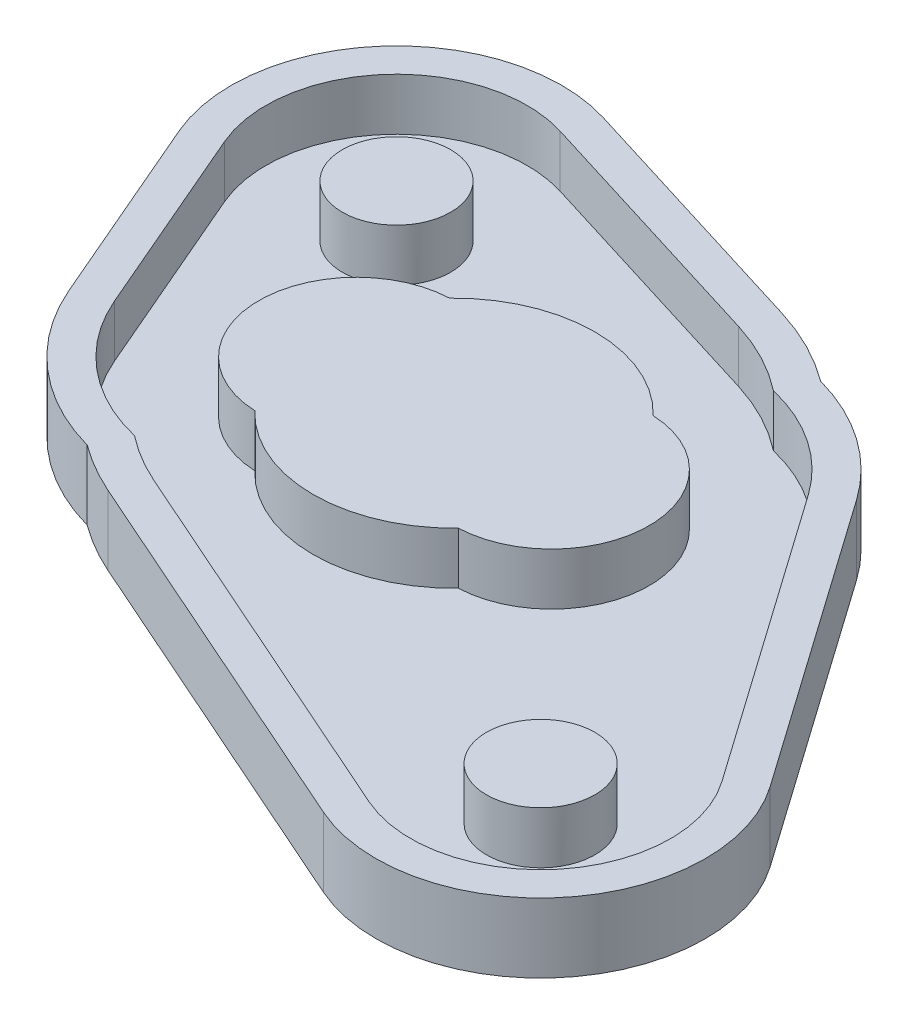
ISO-10303-21;
HEADER;
FILE_DESCRIPTION(('STEP AP214'),'2;1');
FILE_NAME('part.step','',(''),(''),'','','');
FILE_SCHEMA(('AUTOMOTIVE_DESIGN { 1 0 10303 214 1 1 1 1 }'));
ENDSEC;
DATA;
#1=APPLICATION_CONTEXT('core data for automotive mechanical design processes');
#2=APPLICATION_PROTOCOL_DEFINITION('international standard','automotive_design',2000,#1);
#3=PRODUCT_CONTEXT('',#1,'mechanical');
#4=PRODUCT('Part','Part','',(#3));
#5=PRODUCT_RELATED_PRODUCT_CATEGORY('part','',(#4));
#6=PRODUCT_DEFINITION_FORMATION('','',#4);
#7=PRODUCT_DEFINITION_CONTEXT('part definition',#1,'design');
#8=PRODUCT_DEFINITION('design','',#6,#7);
#9=PRODUCT_DEFINITION_SHAPE('','',#8);
#10=(LENGTH_UNIT() NAMED_UNIT(*) SI_UNIT(.MILLI.,.METRE.));
#11=(NAMED_UNIT(*) PLANE_ANGLE_UNIT() SI_UNIT($,.RADIAN.));
#12=(NAMED_UNIT(*) SI_UNIT($,.STERADIAN.) SOLID_ANGLE_UNIT());
#13=UNCERTAINTY_MEASURE_WITH_UNIT(LENGTH_MEASURE(1.E-05),#10,'distance_accuracy_value','');
#14=(GEOMETRIC_REPRESENTATION_CONTEXT(3) GLOBAL_UNCERTAINTY_ASSIGNED_CONTEXT((#13)) GLOBAL_UNIT_ASSIGNED_CONTEXT((#10,
#11,#12)) REPRESENTATION_CONTEXT('',''));
#15=CARTESIAN_POINT('',(0.,0.,0.));
#16=DIRECTION('',(0.,0.,1.));
#17=DIRECTION('',(1.,0.,0.));
#18=AXIS2_PLACEMENT_3D('',#15,#16,#17);
#19=CARTESIAN_POINT('',(-5.62499999999999,3.,0.));
#20=DIRECTION('',(0.,-1.,0.));
#21=DIRECTION('',(0.,0.,-1.));
#22=AXIS2_PLACEMENT_3D('',#19,#20,#21);
#23=CYLINDRICAL_SURFACE('',#22,12.625);
#24=DIRECTION('',(0.,-1.,0.));
#25=VECTOR('',#24,1.);
#26=CARTESIAN_POINT('',(-17.2229499881261,3.,4.98780323117542));
#27=LINE('',#26,#25);
#28=CARTESIAN_POINT('',(-17.2229499881261,3.,4.98780323117542));
#29=VERTEX_POINT('',#28);
#30=CARTESIAN_POINT('',(-17.2229499881261,-1.,4.98780323117542));
#31=VERTEX_POINT('',#30);
#32=EDGE_CURVE('E582',#29,#31,#27,.T.);
#33=ORIENTED_EDGE('',*,*,#32,.T.);
#34=CARTESIAN_POINT('',(-5.62499999999999,-1.,0.));
#35=DIRECTION('',(0.,-1.,0.));
#36=DIRECTION('',(0.,0.,-1.));
#37=AXIS2_PLACEMENT_3D('',#34,#35,#36);
#38=CIRCLE('',#37,12.625);
#39=CARTESIAN_POINT('',(-8.97916666666668,-1.,12.1712855102582));
#40=VERTEX_POINT('',#39);
#41=EDGE_CURVE('E438',#40,#31,#38,.T.);
#42=ORIENTED_EDGE('',*,*,#41,.F.);
#43=DIRECTION('',(0.,-1.,0.));
#44=VECTOR('',#43,1.);
#45=CARTESIAN_POINT('',(-8.97916666666669,3.,12.1712855102582));
#46=LINE('',#45,#44);
#47=CARTESIAN_POINT('',(-8.97916666666669,3.,12.1712855102582));
#48=VERTEX_POINT('',#47);
#49=EDGE_CURVE('E610',#48,#40,#46,.T.);
#50=ORIENTED_EDGE('',*,*,#49,.F.);
#51=CARTESIAN_POINT('',(-5.62499999999999,3.,0.));
#52=DIRECTION('',(0.,1.,0.));
#53=DIRECTION('',(0.,0.,1.));
#54=AXIS2_PLACEMENT_3D('',#51,#52,#53);
#55=CIRCLE('',#54,12.625);
#56=EDGE_CURVE('E513',#48,#29,#55,.F.);
#57=ORIENTED_EDGE('',*,*,#56,.T.);
#58=EDGE_LOOP('',(#33,#42,#50,#57));
#59=FACE_BOUND('',#58,.T.);
#60=ADVANCED_FACE('F230',(#59),#23,.T.);
#61=CARTESIAN_POINT('',(0.,3.,0.));
#62=DIRECTION('',(0.,-1.,0.));
#63=DIRECTION('',(0.,0.,-1.));
#64=AXIS2_PLACEMENT_3D('',#61,#62,#63);
#65=CYLINDRICAL_SURFACE('',#64,15.125);
#66=ORIENTED_EDGE('',*,*,#49,.T.);
#67=CARTESIAN_POINT('',(0.,-1.,0.));
#68=DIRECTION('',(0.,-1.,0.));
#69=DIRECTION('',(0.,0.,-1.));
#70=AXIS2_PLACEMENT_3D('',#67,#68,#69);
#71=CIRCLE('',#70,15.125);
#72=CARTESIAN_POINT('',(-6.11980577871939,-1.,13.8316160382926));
#73=VERTEX_POINT('',#72);
#74=EDGE_CURVE('E419',#73,#40,#71,.T.);
#75=ORIENTED_EDGE('',*,*,#74,.F.);
#76=DIRECTION('',(0.,-1.,0.));
#77=VECTOR('',#76,1.);
#78=CARTESIAN_POINT('',(-6.11980577871939,3.,13.8316160382926));
#79=LINE('',#78,#77);
#80=CARTESIAN_POINT('',(-6.11980577871939,3.,13.8316160382926));
#81=VERTEX_POINT('',#80);
#82=EDGE_CURVE('E607',#81,#73,#79,.T.);
#83=ORIENTED_EDGE('',*,*,#82,.F.);
#84=CARTESIAN_POINT('',(0.,3.,0.));
#85=DIRECTION('',(0.,1.,0.));
#86=DIRECTION('',(0.,0.,1.));
#87=AXIS2_PLACEMENT_3D('',#84,#85,#86);
#88=CIRCLE('',#87,15.125);
#89=EDGE_CURVE('E517',#48,#81,#88,.T.);
#90=ORIENTED_EDGE('',*,*,#89,.F.);
#91=EDGE_LOOP('',(#66,#75,#83,#90));
#92=FACE_BOUND('',#91,.T.);
#93=ADVANCED_FACE('F713',(#92),#65,.T.);
#94=CARTESIAN_POINT('',(-6.1198057787194,3.,13.8316160382926));
#95=DIRECTION('',(0.40461525809715,0.,-0.914487010796204));
#96=DIRECTION('',(-0.914487010796204,0.,-0.404615258097151));
#97=AXIS2_PLACEMENT_3D('',#94,#95,#96);
#98=PLANE('',#97);
#99=ORIENTED_EDGE('',*,*,#82,.T.);
#100=DIRECTION('',(-0.914487010796204,0.,-0.40461525809715));
#101=VECTOR('',#100,1.);
#102=CARTESIAN_POINT('',(16.1561550480772,-1.,23.6876266025639));
#103=LINE('',#102,#101);
#104=CARTESIAN_POINT('',(16.1561550480772,-1.,23.6876266025639));
#105=VERTEX_POINT('',#104);
#106=EDGE_CURVE('E470',#105,#73,#103,.T.);
#107=ORIENTED_EDGE('',*,*,#106,.F.);
#108=DIRECTION('',(0.,-1.,0.));
#109=VECTOR('',#108,1.);
#110=CARTESIAN_POINT('',(16.1561550480772,3.,23.6876266025639));
#111=LINE('',#110,#109);
#112=CARTESIAN_POINT('',(16.1561550480772,3.,23.6876266025639));
#113=VERTEX_POINT('',#112);
#114=EDGE_CURVE('E604',#113,#105,#111,.T.);
#115=ORIENTED_EDGE('',*,*,#114,.F.);
#116=DIRECTION('',(0.914487010796204,0.,0.404615258097151));
#117=VECTOR('',#116,1.);
#118=CARTESIAN_POINT('',(-6.1198057787194,3.,13.8316160382926));
#119=LINE('',#118,#117);
#120=EDGE_CURVE('E521',#81,#113,#119,.T.);
#121=ORIENTED_EDGE('',*,*,#120,.F.);
#122=EDGE_LOOP('',(#99,#107,#115,#121));
#123=FACE_BOUND('',#122,.T.);
#124=ADVANCED_FACE('F716',(#123),#98,.F.);
#125=CARTESIAN_POINT('',(20.0000000000001,3.,15.));
#126=DIRECTION('',(0.,-1.,0.));
#127=DIRECTION('',(0.,0.,-1.));
#128=AXIS2_PLACEMENT_3D('',#125,#126,#127);
#129=CYLINDRICAL_SURFACE('',#128,9.50000000000001);
#130=ORIENTED_EDGE('',*,*,#114,.T.);
#131=CARTESIAN_POINT('',(20.0000000000001,-1.,15.));
#132=DIRECTION('',(0.,-1.,0.));
#133=DIRECTION('',(0.,0.,-1.));
#134=AXIS2_PLACEMENT_3D('',#131,#132,#133);
#135=CIRCLE('',#134,9.50000000000001);
#136=CARTESIAN_POINT('',(27.7695426123718,-1.,9.53335499647711));
#137=VERTEX_POINT('',#136);
#138=EDGE_CURVE('E466',#137,#105,#135,.T.);
#139=ORIENTED_EDGE('',*,*,#138,.F.);
#140=DIRECTION('',(0.,-1.,0.));
#141=VECTOR('',#140,1.);
#142=CARTESIAN_POINT('',(27.7695426123718,3.,9.53335499647711));
#143=LINE('',#142,#141);
#144=CARTESIAN_POINT('',(27.7695426123718,3.,9.53335499647711));
#145=VERTEX_POINT('',#144);
#146=EDGE_CURVE('E601',#145,#137,#143,.T.);
#147=ORIENTED_EDGE('',*,*,#146,.F.);
#148=CARTESIAN_POINT('',(20.0000000000001,3.,15.));
#149=DIRECTION('',(0.,1.,0.));
#150=DIRECTION('',(0.,0.,1.));
#151=AXIS2_PLACEMENT_3D('',#148,#149,#150);
#152=CIRCLE('',#151,9.50000000000001);
#153=EDGE_CURVE('E525',#113,#145,#152,.T.);
#154=ORIENTED_EDGE('',*,*,#153,.F.);
#155=EDGE_LOOP('',(#130,#139,#147,#154));
#156=FACE_BOUND('',#155,.T.);
#157=ADVANCED_FACE('F723',(#156),#129,.T.);
#158=CARTESIAN_POINT('',(14.0877240925432,3.,-9.91211328178847));
#159=DIRECTION('',(0.817846590775959,0.,-0.575436316160303));
#160=DIRECTION('',(-0.575436316160303,0.,-0.81784659077596));
#161=AXIS2_PLACEMENT_3D('',#158,#159,#160);
#162=PLANE('',#161);
#163=ORIENTED_EDGE('',*,*,#146,.T.);
#164=DIRECTION('',(0.575436316160303,0.,0.817846590775959));
#165=VECTOR('',#164,1.);
#166=CARTESIAN_POINT('',(15.9503132085465,-1.,-7.26488349152382));
#167=LINE('',#166,#165);
#168=CARTESIAN_POINT('',(15.9503132085465,-1.,-7.26488349152382));
#169=VERTEX_POINT('',#168);
#170=EDGE_CURVE('E462',#169,#137,#167,.T.);
#171=ORIENTED_EDGE('',*,*,#170,.F.);
#172=DIRECTION('',(0.,-1.,0.));
#173=VECTOR('',#172,1.);
#174=CARTESIAN_POINT('',(15.9503132085465,3.,-7.26488349152382));
#175=LINE('',#174,#173);
#176=CARTESIAN_POINT('',(15.9503132085465,3.,-7.26488349152382));
#177=VERTEX_POINT('',#176);
#178=EDGE_CURVE('E598',#177,#169,#175,.T.);
#179=ORIENTED_EDGE('',*,*,#178,.F.);
#180=DIRECTION('',(0.575436316160303,0.,0.81784659077596));
#181=VECTOR('',#180,1.);
#182=CARTESIAN_POINT('',(14.0877240925432,3.,-9.91211328178847));
#183=LINE('',#182,#181);
#184=EDGE_CURVE('E528',#177,#145,#183,.T.);
#185=ORIENTED_EDGE('',*,*,#184,.T.);
#186=EDGE_LOOP('',(#163,#171,#179,#185));
#187=FACE_BOUND('',#186,.T.);
#188=ADVANCED_FACE('F728',(#187),#162,.T.);
#189=CARTESIAN_POINT('',(5.62499999999999,3.,0.));
#190=DIRECTION('',(0.,-1.,0.));
#191=DIRECTION('',(0.,0.,-1.));
#192=AXIS2_PLACEMENT_3D('',#189,#190,#191);
#193=CYLINDRICAL_SURFACE('',#192,12.625);
#194=ORIENTED_EDGE('',*,*,#178,.T.);
#195=CARTESIAN_POINT('',(5.62499999999999,-1.,0.));
#196=DIRECTION('',(0.,-1.,0.));
#197=DIRECTION('',(0.,0.,-1.));
#198=AXIS2_PLACEMENT_3D('',#195,#196,#197);
#199=CIRCLE('',#198,12.625);
#200=CARTESIAN_POINT('',(8.97916666666665,-1.,-12.1712855102582));
#201=VERTEX_POINT('',#200);
#202=EDGE_CURVE('E458',#201,#169,#199,.T.);
#203=ORIENTED_EDGE('',*,*,#202,.F.);
#204=DIRECTION('',(0.,-1.,0.));
#205=VECTOR('',#204,1.);
#206=CARTESIAN_POINT('',(8.97916666666665,3.,-12.1712855102582));
#207=LINE('',#206,#205);
#208=CARTESIAN_POINT('',(8.97916666666665,3.,-12.1712855102582));
#209=VERTEX_POINT('',#208);
#210=EDGE_CURVE('E595',#209,#201,#207,.T.);
#211=ORIENTED_EDGE('',*,*,#210,.F.);
#212=CARTESIAN_POINT('',(5.62499999999999,3.,0.));
#213=DIRECTION('',(0.,1.,0.));
#214=DIRECTION('',(0.,0.,1.));
#215=AXIS2_PLACEMENT_3D('',#212,#213,#214);
#216=CIRCLE('',#215,12.625);
#217=EDGE_CURVE('E532',#177,#209,#216,.T.);
#218=ORIENTED_EDGE('',*,*,#217,.F.);
#219=EDGE_LOOP('',(#194,#203,#211,#218));
#220=FACE_BOUND('',#219,.T.);
#221=ADVANCED_FACE('F731',(#220),#193,.T.);
#222=CARTESIAN_POINT('',(0.,3.,0.));
#223=DIRECTION('',(0.,-1.,0.));
#224=DIRECTION('',(0.,0.,-1.));
#225=AXIS2_PLACEMENT_3D('',#222,#223,#224);
#226=CYLINDRICAL_SURFACE('',#225,15.125);
#227=ORIENTED_EDGE('',*,*,#210,.T.);
#228=CARTESIAN_POINT('',(0.,-1.,0.));
#229=DIRECTION('',(0.,-1.,0.));
#230=DIRECTION('',(0.,0.,-1.));
#231=AXIS2_PLACEMENT_3D('',#228,#229,#230);
#232=CIRCLE('',#231,15.125);
#233=CARTESIAN_POINT('',(4.46813397174806,-1.,-14.4499620695181));
#234=VERTEX_POINT('',#233);
#235=EDGE_CURVE('E454',#234,#201,#232,.T.);
#236=ORIENTED_EDGE('',*,*,#235,.F.);
#237=DIRECTION('',(0.,-1.,0.));
#238=VECTOR('',#237,1.);
#239=CARTESIAN_POINT('',(4.46813397174806,3.,-14.4499620695181));
#240=LINE('',#239,#238);
#241=CARTESIAN_POINT('',(4.46813397174806,3.,-14.4499620695181));
#242=VERTEX_POINT('',#241);
#243=EDGE_CURVE('E592',#242,#234,#240,.T.);
#244=ORIENTED_EDGE('',*,*,#243,.F.);
#245=CARTESIAN_POINT('',(0.,3.,0.));
#246=DIRECTION('',(0.,1.,0.));
#247=DIRECTION('',(0.,0.,1.));
#248=AXIS2_PLACEMENT_3D('',#245,#246,#247);
#249=CIRCLE('',#248,15.125);
#250=EDGE_CURVE('E536',#209,#242,#249,.T.);
#251=ORIENTED_EDGE('',*,*,#250,.F.);
#252=EDGE_LOOP('',(#227,#236,#244,#251));
#253=FACE_BOUND('',#252,.T.);
#254=ADVANCED_FACE('F734',(#253),#226,.T.);
#255=CARTESIAN_POINT('',(4.46813397174806,3.,-14.449962069518));
#256=DIRECTION('',(0.295413816313922,0.,-0.955369393025988));
#257=DIRECTION('',(-0.955369393025988,0.,-0.295413816313922));
#258=AXIS2_PLACEMENT_3D('',#255,#256,#257);
#259=PLANE('',#258);
#260=ORIENTED_EDGE('',*,*,#243,.T.);
#261=DIRECTION('',(0.955369393025988,0.,0.295413816313922));
#262=VECTOR('',#261,1.);
#263=CARTESIAN_POINT('',(-10.4362971430528,-1.,-19.0586243395805));
#264=LINE('',#263,#262);
#265=CARTESIAN_POINT('',(-10.4362971430528,-1.,-19.0586243395805));
#266=VERTEX_POINT('',#265);
#267=EDGE_CURVE('E450',#266,#234,#264,.T.);
#268=ORIENTED_EDGE('',*,*,#267,.F.);
#269=DIRECTION('',(0.,-1.,0.));
#270=VECTOR('',#269,1.);
#271=CARTESIAN_POINT('',(-10.4362971430528,3.,-19.0586243395805));
#272=LINE('',#271,#270);
#273=CARTESIAN_POINT('',(-10.4362971430528,3.,-19.0586243395805));
#274=VERTEX_POINT('',#273);
#275=EDGE_CURVE('E589',#274,#266,#272,.T.);
#276=ORIENTED_EDGE('',*,*,#275,.F.);
#277=DIRECTION('',(0.955369393025988,0.,0.295413816313922));
#278=VECTOR('',#277,1.);
#279=CARTESIAN_POINT('',(4.46813397174806,3.,-14.449962069518));
#280=LINE('',#279,#278);
#281=EDGE_CURVE('E539',#274,#242,#280,.T.);
#282=ORIENTED_EDGE('',*,*,#281,.T.);
#283=EDGE_LOOP('',(#260,#268,#276,#282));
#284=FACE_BOUND('',#283,.T.);
#285=ADVANCED_FACE('F739',(#284),#259,.T.);
#286=CARTESIAN_POINT('',(-13.2554213597741,3.,-9.94156601983052));
#287=DIRECTION('',(0.,-1.,0.));
#288=DIRECTION('',(0.,0.,-1.));
#289=AXIS2_PLACEMENT_3D('',#286,#287,#288);
#290=CYLINDRICAL_SURFACE('',#289,9.54296671664666);
#291=ORIENTED_EDGE('',*,*,#275,.T.);
#292=CARTESIAN_POINT('',(-13.2554213597741,-1.,-9.94156601983052));
#293=DIRECTION('',(0.,-1.,0.));
#294=DIRECTION('',(0.,0.,-1.));
#295=AXIS2_PLACEMENT_3D('',#292,#293,#294);
#296=CIRCLE('',#295,9.54296671664666);
#297=CARTESIAN_POINT('',(-22.0220630008055,-1.,-6.17139253671847));
#298=VERTEX_POINT('',#297);
#299=EDGE_CURVE('E446',#298,#266,#296,.T.);
#300=ORIENTED_EDGE('',*,*,#299,.F.);
#301=DIRECTION('',(0.,-1.,0.));
#302=VECTOR('',#301,1.);
#303=CARTESIAN_POINT('',(-22.0220630008055,3.,-6.17139253671847));
#304=LINE('',#303,#302);
#305=CARTESIAN_POINT('',(-22.0220630008055,3.,-6.17139253671847));
#306=VERTEX_POINT('',#305);
#307=EDGE_CURVE('E585',#306,#298,#304,.T.);
#308=ORIENTED_EDGE('',*,*,#307,.F.);
#309=CARTESIAN_POINT('',(-13.2554213597741,3.,-9.94156601983052));
#310=DIRECTION('',(0.,1.,0.));
#311=DIRECTION('',(0.,0.,1.));
#312=AXIS2_PLACEMENT_3D('',#309,#310,#311);
#313=CIRCLE('',#312,9.54296671664666);
#314=EDGE_CURVE('E543',#274,#306,#313,.T.);
#315=ORIENTED_EDGE('',*,*,#314,.F.);
#316=EDGE_LOOP('',(#291,#300,#308,#315));
#317=FACE_BOUND('',#316,.T.);
#318=ADVANCED_FACE('F744',(#317),#290,.T.);
#319=CARTESIAN_POINT('',(-13.2554213597741,3.,-9.94156601983052));
#320=DIRECTION('',(0.,-1.,0.));
#321=DIRECTION('',(0.,0.,-1.));
#322=AXIS2_PLACEMENT_3D('',#319,#320,#321);
#323=CYLINDRICAL_SURFACE('',#322,7.54296671664666);
#324=CARTESIAN_POINT('',(-13.2554213597741,0.,-9.94156601983052));
#325=DIRECTION('',(0.,1.,0.));
#326=DIRECTION('',(0.,0.,1.));
#327=AXIS2_PLACEMENT_3D('',#324,#325,#326);
#328=CIRCLE('',#327,7.54296671664666);
#329=CARTESIAN_POINT('',(-11.0271247756806,0.,-17.1478855535285));
#330=VERTEX_POINT('',#329);
#331=CARTESIAN_POINT('',(-20.1847639927855,0.,-6.96153958324131));
#332=VERTEX_POINT('',#331);
#333=EDGE_CURVE('E474',#330,#332,#328,.T.);
#334=ORIENTED_EDGE('',*,*,#333,.F.);
#335=DIRECTION('',(0.,-1.,0.));
#336=VECTOR('',#335,1.);
#337=CARTESIAN_POINT('',(-11.0271247756806,3.,-17.1478855535285));
#338=LINE('',#337,#336);
#339=CARTESIAN_POINT('',(-11.0271247756806,3.,-17.1478855535285));
#340=VERTEX_POINT('',#339);
#341=EDGE_CURVE('E586',#340,#330,#338,.T.);
#342=ORIENTED_EDGE('',*,*,#341,.F.);
#343=CARTESIAN_POINT('',(-13.2554213597741,3.,-9.94156601983052));
#344=DIRECTION('',(0.,1.,0.));
#345=DIRECTION('',(0.,0.,1.));
#346=AXIS2_PLACEMENT_3D('',#343,#344,#345);
#347=CIRCLE('',#346,7.54296671664666);
#348=CARTESIAN_POINT('',(-20.1847639927855,3.,-6.96153958324131));
#349=VERTEX_POINT('',#348);
#350=EDGE_CURVE('E475',#340,#349,#347,.T.);
#351=ORIENTED_EDGE('',*,*,#350,.T.);
#352=DIRECTION('',(0.,-1.,0.));
#353=VECTOR('',#352,1.);
#354=CARTESIAN_POINT('',(-20.1847639927855,3.,-6.96153958324131));
#355=LINE('',#354,#353);
#356=EDGE_CURVE('E550',#349,#332,#355,.T.);
#357=ORIENTED_EDGE('',*,*,#356,.T.);
#358=EDGE_LOOP('',(#334,#342,#351,#357));
#359=FACE_BOUND('',#358,.T.);
#360=ADVANCED_FACE('F232',(#359),#323,.F.);
#361=CARTESIAN_POINT('',(3.87730633912022,3.,-12.5392232834661));
#362=DIRECTION('',(0.295413816313921,0.,-0.955369393025988));
#363=DIRECTION('',(-0.955369393025988,0.,-0.295413816313921));
#364=AXIS2_PLACEMENT_3D('',#361,#362,#363);
#365=PLANE('',#364);
#366=DIRECTION('',(0.955369393025988,0.,0.295413816313921));
#367=VECTOR('',#366,1.);
#368=CARTESIAN_POINT('',(3.87730633912022,0.,-12.5392232834661));
#369=LINE('',#368,#367);
#370=CARTESIAN_POINT('',(3.87730633912022,0.,-12.5392232834661));
#371=VERTEX_POINT('',#370);
#372=EDGE_CURVE('E553',#330,#371,#369,.T.);
#373=ORIENTED_EDGE('',*,*,#372,.T.);
#374=DIRECTION('',(0.,-1.,0.));
#375=VECTOR('',#374,1.);
#376=CARTESIAN_POINT('',(3.87730633912022,3.,-12.5392232834661));
#377=LINE('',#376,#375);
#378=CARTESIAN_POINT('',(3.87730633912022,3.,-12.5392232834661));
#379=VERTEX_POINT('',#378);
#380=EDGE_CURVE('E644',#379,#371,#377,.T.);
#381=ORIENTED_EDGE('',*,*,#380,.F.);
#382=DIRECTION('',(0.955369393025988,0.,0.295413816313921));
#383=VECTOR('',#382,1.);
#384=CARTESIAN_POINT('',(3.87730633912022,3.,-12.5392232834661));
#385=LINE('',#384,#383);
#386=EDGE_CURVE('E479',#340,#379,#385,.T.);
#387=ORIENTED_EDGE('',*,*,#386,.F.);
#388=ORIENTED_EDGE('',*,*,#341,.T.);
#389=EDGE_LOOP('',(#373,#381,#387,#388));
#390=FACE_BOUND('',#389,.T.);
#391=ADVANCED_FACE('F666',(#390),#365,.F.);
#392=CARTESIAN_POINT('',(0.,3.,0.));
#393=DIRECTION('',(0.,-1.,0.));
#394=DIRECTION('',(0.,0.,-1.));
#395=AXIS2_PLACEMENT_3D('',#392,#393,#394);
#396=CYLINDRICAL_SURFACE('',#395,13.125);
#397=CARTESIAN_POINT('',(0.,0.,0.));
#398=DIRECTION('',(0.,1.,0.));
#399=DIRECTION('',(0.,0.,1.));
#400=AXIS2_PLACEMENT_3D('',#397,#398,#399);
#401=CIRCLE('',#400,13.125);
#402=CARTESIAN_POINT('',(8.09027777777776,0.,-10.3350389684023));
#403=VERTEX_POINT('',#402);
#404=EDGE_CURVE('E557',#403,#371,#401,.T.);
#405=ORIENTED_EDGE('',*,*,#404,.F.);
#406=DIRECTION('',(0.,-1.,0.));
#407=VECTOR('',#406,1.);
#408=CARTESIAN_POINT('',(8.09027777777776,3.,-10.3350389684023));
#409=LINE('',#408,#407);
#410=CARTESIAN_POINT('',(8.09027777777776,3.,-10.3350389684023));
#411=VERTEX_POINT('',#410);
#412=EDGE_CURVE('E640',#411,#403,#409,.T.);
#413=ORIENTED_EDGE('',*,*,#412,.F.);
#414=CARTESIAN_POINT('',(0.,3.,0.));
#415=DIRECTION('',(0.,1.,0.));
#416=DIRECTION('',(0.,0.,1.));
#417=AXIS2_PLACEMENT_3D('',#414,#415,#416);
#418=CIRCLE('',#417,13.125);
#419=EDGE_CURVE('E483',#411,#379,#418,.T.);
#420=ORIENTED_EDGE('',*,*,#419,.T.);
#421=ORIENTED_EDGE('',*,*,#380,.T.);
#422=EDGE_LOOP('',(#405,#413,#420,#421));
#423=FACE_BOUND('',#422,.T.);
#424=ADVANCED_FACE('F699',(#423),#396,.F.);
#425=CARTESIAN_POINT('',(5.62499999999999,3.,0.));
#426=DIRECTION('',(0.,-1.,0.));
#427=DIRECTION('',(0.,0.,-1.));
#428=AXIS2_PLACEMENT_3D('',#425,#426,#427);
#429=CYLINDRICAL_SURFACE('',#428,10.625);
#430=CARTESIAN_POINT('',(5.62499999999999,0.,0.));
#431=DIRECTION('',(0.,1.,0.));
#432=DIRECTION('',(0.,0.,1.));
#433=AXIS2_PLACEMENT_3D('',#430,#431,#432);
#434=CIRCLE('',#433,10.625);
#435=CARTESIAN_POINT('',(14.3146200269946,0.,-6.11401085920322));
#436=VERTEX_POINT('',#435);
#437=EDGE_CURVE('E560',#436,#403,#434,.T.);
#438=ORIENTED_EDGE('',*,*,#437,.F.);
#439=DIRECTION('',(0.,-1.,0.));
#440=VECTOR('',#439,1.);
#441=CARTESIAN_POINT('',(14.3146200269946,3.,-6.11401085920322));
#442=LINE('',#441,#440);
#443=CARTESIAN_POINT('',(14.3146200269946,3.,-6.11401085920322));
#444=VERTEX_POINT('',#443);
#445=EDGE_CURVE('E636',#444,#436,#442,.T.);
#446=ORIENTED_EDGE('',*,*,#445,.F.);
#447=CARTESIAN_POINT('',(5.62499999999999,3.,0.));
#448=DIRECTION('',(0.,1.,0.));
#449=DIRECTION('',(0.,0.,1.));
#450=AXIS2_PLACEMENT_3D('',#447,#448,#449);
#451=CIRCLE('',#450,10.625);
#452=EDGE_CURVE('E487',#444,#411,#451,.T.);
#453=ORIENTED_EDGE('',*,*,#452,.T.);
#454=ORIENTED_EDGE('',*,*,#412,.T.);
#455=EDGE_LOOP('',(#438,#446,#453,#454));
#456=FACE_BOUND('',#455,.T.);
#457=ADVANCED_FACE('F696',(#456),#429,.F.);
#458=CARTESIAN_POINT('',(12.4520309109913,3.,-8.76124064946786));
#459=DIRECTION('',(0.81784659077596,0.,-0.575436316160303));
#460=DIRECTION('',(-0.575436316160303,0.,-0.81784659077596));
#461=AXIS2_PLACEMENT_3D('',#458,#459,#460);
#462=PLANE('',#461);
#463=DIRECTION('',(0.575436316160303,0.,0.81784659077596));
#464=VECTOR('',#463,1.);
#465=CARTESIAN_POINT('',(12.4520309109913,0.,-8.76124064946786));
#466=LINE('',#465,#464);
#467=CARTESIAN_POINT('',(26.1338494308198,0.,10.6842276287977));
#468=VERTEX_POINT('',#467);
#469=EDGE_CURVE('E563',#436,#468,#466,.T.);
#470=ORIENTED_EDGE('',*,*,#469,.T.);
#471=DIRECTION('',(0.,-1.,0.));
#472=VECTOR('',#471,1.);
#473=CARTESIAN_POINT('',(26.1338494308198,3.,10.6842276287977));
#474=LINE('',#473,#472);
#475=CARTESIAN_POINT('',(26.1338494308198,3.,10.6842276287977));
#476=VERTEX_POINT('',#475);
#477=EDGE_CURVE('E632',#476,#468,#474,.T.);
#478=ORIENTED_EDGE('',*,*,#477,.F.);
#479=DIRECTION('',(0.575436316160303,0.,0.81784659077596));
#480=VECTOR('',#479,1.);
#481=CARTESIAN_POINT('',(12.4520309109913,3.,-8.76124064946786));
#482=LINE('',#481,#480);
#483=EDGE_CURVE('E491',#444,#476,#482,.T.);
#484=ORIENTED_EDGE('',*,*,#483,.F.);
#485=ORIENTED_EDGE('',*,*,#445,.T.);
#486=EDGE_LOOP('',(#470,#478,#484,#485));
#487=FACE_BOUND('',#486,.T.);
#488=ADVANCED_FACE('F692',(#487),#462,.F.);
#489=CARTESIAN_POINT('',(20.0000000000001,3.,15.));
#490=DIRECTION('',(0.,-1.,0.));
#491=DIRECTION('',(0.,0.,-1.));
#492=AXIS2_PLACEMENT_3D('',#489,#490,#491);
#493=CYLINDRICAL_SURFACE('',#492,7.5);
#494=CARTESIAN_POINT('',(20.0000000000001,0.,15.));
#495=DIRECTION('',(0.,1.,0.));
#496=DIRECTION('',(0.,0.,1.));
#497=AXIS2_PLACEMENT_3D('',#494,#495,#496);
#498=CIRCLE('',#497,7.5);
#499=CARTESIAN_POINT('',(16.9653855642715,0.,21.8586525809715));
#500=VERTEX_POINT('',#499);
#501=EDGE_CURVE('E567',#500,#468,#498,.T.);
#502=ORIENTED_EDGE('',*,*,#501,.F.);
#503=DIRECTION('',(0.,-1.,0.));
#504=VECTOR('',#503,1.);
#505=CARTESIAN_POINT('',(16.9653855642715,3.,21.8586525809715));
#506=LINE('',#505,#504);
#507=CARTESIAN_POINT('',(16.9653855642715,3.,21.8586525809715));
#508=VERTEX_POINT('',#507);
#509=EDGE_CURVE('E628',#508,#500,#506,.T.);
#510=ORIENTED_EDGE('',*,*,#509,.F.);
#511=CARTESIAN_POINT('',(20.0000000000001,3.,15.));
#512=DIRECTION('',(0.,1.,0.));
#513=DIRECTION('',(0.,0.,1.));
#514=AXIS2_PLACEMENT_3D('',#511,#512,#513);
#515=CIRCLE('',#514,7.5);
#516=EDGE_CURVE('E494',#508,#476,#515,.T.);
#517=ORIENTED_EDGE('',*,*,#516,.T.);
#518=ORIENTED_EDGE('',*,*,#477,.T.);
#519=EDGE_LOOP('',(#502,#510,#517,#518));
#520=FACE_BOUND('',#519,.T.);
#521=ADVANCED_FACE('F688',(#520),#493,.F.);
#522=CARTESIAN_POINT('',(-5.31057526252509,3.,12.0026420167002));
#523=DIRECTION('',(0.40461525809715,0.,-0.914487010796204));
#524=DIRECTION('',(-0.914487010796204,0.,-0.40461525809715));
#525=AXIS2_PLACEMENT_3D('',#522,#523,#524);
#526=PLANE('',#525);
#527=DIRECTION('',(0.914487010796204,0.,0.40461525809715));
#528=VECTOR('',#527,1.);
#529=CARTESIAN_POINT('',(-5.31057526252509,0.,12.0026420167002));
#530=LINE('',#529,#528);
#531=CARTESIAN_POINT('',(-5.31057526252509,0.,12.0026420167002));
#532=VERTEX_POINT('',#531);
#533=EDGE_CURVE('E570',#532,#500,#530,.T.);
#534=ORIENTED_EDGE('',*,*,#533,.F.);
#535=DIRECTION('',(0.,-1.,0.));
#536=VECTOR('',#535,1.);
#537=CARTESIAN_POINT('',(-5.31057526252509,3.,12.0026420167002));
#538=LINE('',#537,#536);
#539=CARTESIAN_POINT('',(-5.31057526252509,3.,12.0026420167002));
#540=VERTEX_POINT('',#539);
#541=EDGE_CURVE('E624',#540,#532,#538,.T.);
#542=ORIENTED_EDGE('',*,*,#541,.F.);
#543=DIRECTION('',(0.914487010796204,0.,0.40461525809715));
#544=VECTOR('',#543,1.);
#545=CARTESIAN_POINT('',(-5.31057526252509,3.,12.0026420167002));
#546=LINE('',#545,#544);
#547=EDGE_CURVE('E498',#540,#508,#546,.T.);
#548=ORIENTED_EDGE('',*,*,#547,.T.);
#549=ORIENTED_EDGE('',*,*,#509,.T.);
#550=EDGE_LOOP('',(#534,#542,#548,#549));
#551=FACE_BOUND('',#550,.T.);
#552=ADVANCED_FACE('F684',(#551),#526,.T.);
#553=CARTESIAN_POINT('',(0.,3.,0.));
#554=DIRECTION('',(0.,-1.,0.));
#555=DIRECTION('',(0.,0.,-1.));
#556=AXIS2_PLACEMENT_3D('',#553,#554,#555);
#557=CYLINDRICAL_SURFACE('',#556,13.125);
#558=CARTESIAN_POINT('',(0.,0.,0.));
#559=DIRECTION('',(0.,1.,0.));
#560=DIRECTION('',(0.,0.,1.));
#561=AXIS2_PLACEMENT_3D('',#558,#559,#560);
#562=CIRCLE('',#561,13.125);
#563=CARTESIAN_POINT('',(-8.0902777777778,0.,10.3350389684023));
#564=VERTEX_POINT('',#563);
#565=EDGE_CURVE('E573',#564,#532,#562,.T.);
#566=ORIENTED_EDGE('',*,*,#565,.F.);
#567=DIRECTION('',(0.,-1.,0.));
#568=VECTOR('',#567,1.);
#569=CARTESIAN_POINT('',(-8.0902777777778,3.,10.3350389684023));
#570=LINE('',#569,#568);
#571=CARTESIAN_POINT('',(-8.0902777777778,3.,10.3350389684023));
#572=VERTEX_POINT('',#571);
#573=EDGE_CURVE('E620',#572,#564,#570,.T.);
#574=ORIENTED_EDGE('',*,*,#573,.F.);
#575=CARTESIAN_POINT('',(0.,3.,0.));
#576=DIRECTION('',(0.,1.,0.));
#577=DIRECTION('',(0.,0.,1.));
#578=AXIS2_PLACEMENT_3D('',#575,#576,#577);
#579=CIRCLE('',#578,13.125);
#580=EDGE_CURVE('E502',#572,#540,#579,.T.);
#581=ORIENTED_EDGE('',*,*,#580,.T.);
#582=ORIENTED_EDGE('',*,*,#541,.T.);
#583=EDGE_LOOP('',(#566,#574,#581,#582));
#584=FACE_BOUND('',#583,.T.);
#585=ADVANCED_FACE('F680',(#584),#557,.F.);
#586=CARTESIAN_POINT('',(-5.62499999999999,3.,0.));
#587=DIRECTION('',(0.,-1.,0.));
#588=DIRECTION('',(0.,0.,-1.));
#589=AXIS2_PLACEMENT_3D('',#586,#587,#588);
#590=CYLINDRICAL_SURFACE('',#589,10.625);
#591=CARTESIAN_POINT('',(-5.62499999999999,0.,0.));
#592=DIRECTION('',(0.,1.,0.));
#593=DIRECTION('',(0.,0.,1.));
#594=AXIS2_PLACEMENT_3D('',#591,#592,#593);
#595=CIRCLE('',#594,10.625);
#596=CARTESIAN_POINT('',(-15.3856509801062,0.,4.19765618465258));
#597=VERTEX_POINT('',#596);
#598=EDGE_CURVE('E576',#564,#597,#595,.F.);
#599=ORIENTED_EDGE('',*,*,#598,.T.);
#600=DIRECTION('',(0.,-1.,0.));
#601=VECTOR('',#600,1.);
#602=CARTESIAN_POINT('',(-15.3856509801062,3.,4.19765618465258));
#603=LINE('',#602,#601);
#604=CARTESIAN_POINT('',(-15.3856509801062,3.,4.19765618465258));
#605=VERTEX_POINT('',#604);
#606=EDGE_CURVE('E616',#605,#597,#603,.T.);
#607=ORIENTED_EDGE('',*,*,#606,.F.);
#608=CARTESIAN_POINT('',(-5.62499999999999,3.,0.));
#609=DIRECTION('',(0.,1.,0.));
#610=DIRECTION('',(0.,0.,1.));
#611=AXIS2_PLACEMENT_3D('',#608,#609,#610);
#612=CIRCLE('',#611,10.625);
#613=EDGE_CURVE('E506',#572,#605,#612,.F.);
#614=ORIENTED_EDGE('',*,*,#613,.F.);
#615=ORIENTED_EDGE('',*,*,#573,.T.);
#616=EDGE_LOOP('',(#599,#607,#614,#615));
#617=FACE_BOUND('',#616,.T.);
#618=ADVANCED_FACE('F677',(#617),#590,.F.);
#619=CARTESIAN_POINT('',(-14.5076836057063,3.,6.23916047573023));
#620=DIRECTION('',(0.918649504009994,0.,-0.395073523261419));
#621=DIRECTION('',(-0.395073523261419,0.,-0.918649504009994));
#622=AXIS2_PLACEMENT_3D('',#619,#620,#621);
#623=PLANE('',#622);
#624=DIRECTION('',(0.395073523261419,0.,0.918649504009994));
#625=VECTOR('',#624,1.);
#626=CARTESIAN_POINT('',(-14.5076836057063,0.,6.23916047573023));
#627=LINE('',#626,#625);
#628=EDGE_CURVE('E480',#332,#597,#627,.T.);
#629=ORIENTED_EDGE('',*,*,#628,.F.);
#630=ORIENTED_EDGE('',*,*,#356,.F.);
#631=DIRECTION('',(0.395073523261419,0.,0.918649504009994));
#632=VECTOR('',#631,1.);
#633=CARTESIAN_POINT('',(-14.5076836057063,3.,6.23916047573023));
#634=LINE('',#633,#632);
#635=EDGE_CURVE('E509',#349,#605,#634,.T.);
#636=ORIENTED_EDGE('',*,*,#635,.T.);
#637=ORIENTED_EDGE('',*,*,#606,.T.);
#638=EDGE_LOOP('',(#629,#630,#636,#637));
#639=FACE_BOUND('',#638,.T.);
#640=ADVANCED_FACE('F672',(#639),#623,.T.);
#641=CARTESIAN_POINT('',(-16.3449826137263,3.,7.02930752225307));
#642=DIRECTION('',(0.918649504009994,0.,-0.39507352326142));
#643=DIRECTION('',(-0.39507352326142,0.,-0.918649504009994));
#644=AXIS2_PLACEMENT_3D('',#641,#642,#643);
#645=PLANE('',#644);
#646=ORIENTED_EDGE('',*,*,#307,.T.);
#647=DIRECTION('',(-0.395073523261419,0.,-0.918649504009994));
#648=VECTOR('',#647,1.);
#649=CARTESIAN_POINT('',(-17.2229499881262,-1.,4.98780323117542));
#650=LINE('',#649,#648);
#651=EDGE_CURVE('E442',#31,#298,#650,.T.);
#652=ORIENTED_EDGE('',*,*,#651,.F.);
#653=ORIENTED_EDGE('',*,*,#32,.F.);
#654=DIRECTION('',(0.39507352326142,0.,0.918649504009994));
#655=VECTOR('',#654,1.);
#656=CARTESIAN_POINT('',(-16.3449826137263,3.,7.02930752225307));
#657=LINE('',#656,#655);
#658=EDGE_CURVE('E547',#306,#29,#657,.T.);
#659=ORIENTED_EDGE('',*,*,#658,.F.);
#660=EDGE_LOOP('',(#646,#652,#653,#659));
#661=FACE_BOUND('',#660,.T.);
#662=ADVANCED_FACE('F703',(#661),#645,.F.);
#663=CARTESIAN_POINT('',(0.,3.,0.));
#664=DIRECTION('',(0.,1.,0.));
#665=DIRECTION('',(0.,0.,1.));
#666=AXIS2_PLACEMENT_3D('',#663,#664,#665);
#667=PLANE('',#666);
#668=ORIENTED_EDGE('',*,*,#350,.F.);
#669=ORIENTED_EDGE('',*,*,#386,.T.);
#670=ORIENTED_EDGE('',*,*,#419,.F.);
#671=ORIENTED_EDGE('',*,*,#452,.F.);
#672=ORIENTED_EDGE('',*,*,#483,.T.);
#673=ORIENTED_EDGE('',*,*,#516,.F.);
#674=ORIENTED_EDGE('',*,*,#547,.F.);
#675=ORIENTED_EDGE('',*,*,#580,.F.);
#676=ORIENTED_EDGE('',*,*,#613,.T.);
#677=ORIENTED_EDGE('',*,*,#635,.F.);
#678=EDGE_LOOP('',(#668,#669,#670,#671,#672,#673,#674,#675,#676,#677));
#679=FACE_BOUND('',#678,.T.);
#680=ORIENTED_EDGE('',*,*,#56,.F.);
#681=ORIENTED_EDGE('',*,*,#89,.T.);
#682=ORIENTED_EDGE('',*,*,#120,.T.);
#683=ORIENTED_EDGE('',*,*,#153,.T.);
#684=ORIENTED_EDGE('',*,*,#184,.F.);
#685=ORIENTED_EDGE('',*,*,#217,.T.);
#686=ORIENTED_EDGE('',*,*,#250,.T.);
#687=ORIENTED_EDGE('',*,*,#281,.F.);
#688=ORIENTED_EDGE('',*,*,#314,.T.);
#689=ORIENTED_EDGE('',*,*,#658,.T.);
#690=EDGE_LOOP('',(#680,#681,#682,#683,#684,#685,#686,#687,#688,#689));
#691=FACE_BOUND('',#690,.T.);
#692=ADVANCED_FACE('F658',(#679,#691),#667,.T.);
#693=CARTESIAN_POINT('',(0.,0.,0.));
#694=DIRECTION('',(0.,-1.,0.));
#695=DIRECTION('',(0.,0.,-1.));
#696=AXIS2_PLACEMENT_3D('',#693,#694,#695);
#697=PLANE('',#696);
#698=CARTESIAN_POINT('',(20.0000000000001,0.,15.));
#699=DIRECTION('',(0.,-1.,0.));
#700=DIRECTION('',(0.,0.,-1.));
#701=AXIS2_PLACEMENT_3D('',#698,#699,#700);
#702=CIRCLE('',#701,3.12499999999999);
#703=CARTESIAN_POINT('',(20.0000000000001,0.,11.875));
#704=VERTEX_POINT('',#703);
#705=EDGE_CURVE('E12',#704,#704,#702,.F.);
#706=ORIENTED_EDGE('',*,*,#705,.F.);
#707=EDGE_LOOP('',(#706));
#708=FACE_BOUND('',#707,.T.);
#709=CARTESIAN_POINT('',(0.,0.,0.));
#710=DIRECTION('',(0.,1.,0.));
#711=DIRECTION('',(0.,0.,1.));
#712=AXIS2_PLACEMENT_3D('',#709,#710,#711);
#713=CIRCLE('',#712,8.12499999999999);
#714=CARTESIAN_POINT('',(5.86805555555555,0.,-5.61974634631435));
#715=VERTEX_POINT('',#714);
#716=CARTESIAN_POINT('',(-5.86805555555555,0.,-5.61974634631435));
#717=VERTEX_POINT('',#716);
#718=EDGE_CURVE('E389',#715,#717,#713,.T.);
#719=ORIENTED_EDGE('',*,*,#718,.F.);
#720=CARTESIAN_POINT('',(5.62499999999999,0.,0.));
#721=DIRECTION('',(0.,1.,0.));
#722=DIRECTION('',(0.,0.,1.));
#723=AXIS2_PLACEMENT_3D('',#720,#721,#722);
#724=CIRCLE('',#723,5.62499999999999);
#725=CARTESIAN_POINT('',(5.86805555555555,0.,5.61974634631435));
#726=VERTEX_POINT('',#725);
#727=EDGE_CURVE('E394',#726,#715,#724,.T.);
#728=ORIENTED_EDGE('',*,*,#727,.F.);
#729=CARTESIAN_POINT('',(0.,0.,0.));
#730=DIRECTION('',(0.,1.,0.));
#731=DIRECTION('',(0.,0.,1.));
#732=AXIS2_PLACEMENT_3D('',#729,#730,#731);
#733=CIRCLE('',#732,8.12499999999999);
#734=CARTESIAN_POINT('',(-5.86805555555555,0.,5.61974634631435));
#735=VERTEX_POINT('',#734);
#736=EDGE_CURVE('E251',#735,#726,#733,.T.);
#737=ORIENTED_EDGE('',*,*,#736,.F.);
#738=CARTESIAN_POINT('',(-5.62499999999999,0.,0.));
#739=DIRECTION('',(0.,1.,0.));
#740=DIRECTION('',(0.,0.,1.));
#741=AXIS2_PLACEMENT_3D('',#738,#739,#740);
#742=CIRCLE('',#741,5.62499999999999);
#743=EDGE_CURVE('E246',#735,#717,#742,.F.);
#744=ORIENTED_EDGE('',*,*,#743,.T.);
#745=EDGE_LOOP('',(#719,#728,#737,#744));
#746=FACE_BOUND('',#745,.T.);
#747=CARTESIAN_POINT('',(-13.2554213597741,0.,-9.94156601983052));
#748=DIRECTION('',(0.,-1.,0.));
#749=DIRECTION('',(0.,0.,-1.));
#750=AXIS2_PLACEMENT_3D('',#747,#748,#749);
#751=CIRCLE('',#750,3.125);
#752=CARTESIAN_POINT('',(-13.2554213597741,0.,-13.0665660198305));
#753=VERTEX_POINT('',#752);
#754=EDGE_CURVE('E239',#753,#753,#751,.F.);
#755=ORIENTED_EDGE('',*,*,#754,.F.);
#756=EDGE_LOOP('',(#755));
#757=FACE_BOUND('',#756,.T.);
#758=ORIENTED_EDGE('',*,*,#372,.F.);
#759=ORIENTED_EDGE('',*,*,#333,.T.);
#760=ORIENTED_EDGE('',*,*,#628,.T.);
#761=ORIENTED_EDGE('',*,*,#598,.F.);
#762=ORIENTED_EDGE('',*,*,#565,.T.);
#763=ORIENTED_EDGE('',*,*,#533,.T.);
#764=ORIENTED_EDGE('',*,*,#501,.T.);
#765=ORIENTED_EDGE('',*,*,#469,.F.);
#766=ORIENTED_EDGE('',*,*,#437,.T.);
#767=ORIENTED_EDGE('',*,*,#404,.T.);
#768=EDGE_LOOP('',(#758,#759,#760,#761,#762,#763,#764,#765,#766,#767));
#769=FACE_BOUND('',#768,.T.);
#770=ADVANCED_FACE('F391',(#708,#746,#757,#769),#697,.F.);
#771=CARTESIAN_POINT('',(0.,-1.,0.));
#772=DIRECTION('',(0.,-1.,0.));
#773=DIRECTION('',(0.,0.,-1.));
#774=AXIS2_PLACEMENT_3D('',#771,#772,#773);
#775=PLANE('',#774);
#776=ORIENTED_EDGE('',*,*,#74,.T.);
#777=ORIENTED_EDGE('',*,*,#41,.T.);
#778=ORIENTED_EDGE('',*,*,#651,.T.);
#779=ORIENTED_EDGE('',*,*,#299,.T.);
#780=ORIENTED_EDGE('',*,*,#267,.T.);
#781=ORIENTED_EDGE('',*,*,#235,.T.);
#782=ORIENTED_EDGE('',*,*,#202,.T.);
#783=ORIENTED_EDGE('',*,*,#170,.T.);
#784=ORIENTED_EDGE('',*,*,#138,.T.);
#785=ORIENTED_EDGE('',*,*,#106,.T.);
#786=EDGE_LOOP('',(#776,#777,#778,#779,#780,#781,#782,#783,#784,#785));
#787=FACE_BOUND('',#786,.T.);
#788=ADVANCED_FACE('F657',(#787),#775,.T.);
#789=CARTESIAN_POINT('',(-13.2554213597741,3.,-9.94156601983052));
#790=DIRECTION('',(0.,-1.,0.));
#791=DIRECTION('',(0.,0.,-1.));
#792=AXIS2_PLACEMENT_3D('',#789,#790,#791);
#793=CYLINDRICAL_SURFACE('',#792,3.125);
#794=CARTESIAN_POINT('',(-13.2554213597741,3.,-9.94156601983052));
#795=DIRECTION('',(0.,1.,0.));
#796=DIRECTION('',(0.,0.,1.));
#797=AXIS2_PLACEMENT_3D('',#794,#795,#796);
#798=CIRCLE('',#797,3.125);
#799=CARTESIAN_POINT('',(-13.2554213597741,3.,-6.81656601983053));
#800=VERTEX_POINT('',#799);
#801=EDGE_CURVE('E415',#800,#800,#798,.T.);
#802=ORIENTED_EDGE('',*,*,#801,.F.);
#803=EDGE_LOOP('',(#802));
#804=FACE_BOUND('',#803,.T.);
#805=ORIENTED_EDGE('',*,*,#754,.T.);
#806=EDGE_LOOP('',(#805));
#807=FACE_BOUND('',#806,.T.);
#808=ADVANCED_FACE('F654',(#804,#807),#793,.T.);
#809=CARTESIAN_POINT('',(0.,3.,0.));
#810=DIRECTION('',(0.,1.,0.));
#811=DIRECTION('',(0.,0.,1.));
#812=AXIS2_PLACEMENT_3D('',#809,#810,#811);
#813=PLANE('',#812);
#814=ORIENTED_EDGE('',*,*,#801,.T.);
#815=EDGE_LOOP('',(#814));
#816=FACE_BOUND('',#815,.T.);
#817=ADVANCED_FACE('F909',(#816),#813,.T.);
#818=CARTESIAN_POINT('',(0.,3.,0.));
#819=DIRECTION('',(0.,-1.,0.));
#820=DIRECTION('',(0.,0.,-1.));
#821=AXIS2_PLACEMENT_3D('',#818,#819,#820);
#822=CYLINDRICAL_SURFACE('',#821,8.12499999999999);
#823=ORIENTED_EDGE('',*,*,#718,.T.);
#824=DIRECTION('',(0.,-1.,0.));
#825=VECTOR('',#824,1.);
#826=CARTESIAN_POINT('',(-5.86805555555555,3.,-5.61974634631435));
#827=LINE('',#826,#825);
#828=CARTESIAN_POINT('',(-5.86805555555555,3.,-5.61974634631435));
#829=VERTEX_POINT('',#828);
#830=EDGE_CURVE('E407',#829,#717,#827,.T.);
#831=ORIENTED_EDGE('',*,*,#830,.F.);
#832=CARTESIAN_POINT('',(0.,3.,0.));
#833=DIRECTION('',(0.,1.,0.));
#834=DIRECTION('',(0.,0.,1.));
#835=AXIS2_PLACEMENT_3D('',#832,#833,#834);
#836=CIRCLE('',#835,8.12499999999999);
#837=CARTESIAN_POINT('',(5.86805555555555,3.,-5.61974634631435));
#838=VERTEX_POINT('',#837);
#839=EDGE_CURVE('E402',#838,#829,#836,.T.);
#840=ORIENTED_EDGE('',*,*,#839,.F.);
#841=DIRECTION('',(0.,-1.,0.));
#842=VECTOR('',#841,1.);
#843=CARTESIAN_POINT('',(5.86805555555555,3.,-5.61974634631435));
#844=LINE('',#843,#842);
#845=EDGE_CURVE('E400',#838,#715,#844,.T.);
#846=ORIENTED_EDGE('',*,*,#845,.T.);
#847=EDGE_LOOP('',(#823,#831,#840,#846));
#848=FACE_BOUND('',#847,.T.);
#849=ADVANCED_FACE('F401',(#848),#822,.T.);
#850=CARTESIAN_POINT('',(-5.62499999999999,3.,0.));
#851=DIRECTION('',(0.,-1.,0.));
#852=DIRECTION('',(0.,0.,-1.));
#853=AXIS2_PLACEMENT_3D('',#850,#851,#852);
#854=CYLINDRICAL_SURFACE('',#853,5.62499999999999);
#855=ORIENTED_EDGE('',*,*,#743,.F.);
#856=DIRECTION('',(0.,-1.,0.));
#857=VECTOR('',#856,1.);
#858=CARTESIAN_POINT('',(-5.86805555555555,3.,5.61974634631435));
#859=LINE('',#858,#857);
#860=CARTESIAN_POINT('',(-5.86805555555555,3.,5.61974634631435));
#861=VERTEX_POINT('',#860);
#862=EDGE_CURVE('E1047',#861,#735,#859,.T.);
#863=ORIENTED_EDGE('',*,*,#862,.F.);
#864=CARTESIAN_POINT('',(-5.62499999999999,3.,0.));
#865=DIRECTION('',(0.,1.,0.));
#866=DIRECTION('',(0.,0.,1.));
#867=AXIS2_PLACEMENT_3D('',#864,#865,#866);
#868=CIRCLE('',#867,5.62499999999999);
#869=EDGE_CURVE('E426',#861,#829,#868,.F.);
#870=ORIENTED_EDGE('',*,*,#869,.T.);
#871=ORIENTED_EDGE('',*,*,#830,.T.);
#872=EDGE_LOOP('',(#855,#863,#870,#871));
#873=FACE_BOUND('',#872,.T.);
#874=ADVANCED_FACE('F929',(#873),#854,.T.);
#875=CARTESIAN_POINT('',(0.,3.,0.));
#876=DIRECTION('',(0.,-1.,0.));
#877=DIRECTION('',(0.,0.,-1.));
#878=AXIS2_PLACEMENT_3D('',#875,#876,#877);
#879=CYLINDRICAL_SURFACE('',#878,8.12499999999999);
#880=ORIENTED_EDGE('',*,*,#736,.T.);
#881=DIRECTION('',(0.,-1.,0.));
#882=VECTOR('',#881,1.);
#883=CARTESIAN_POINT('',(5.86805555555555,3.,5.61974634631435));
#884=LINE('',#883,#882);
#885=CARTESIAN_POINT('',(5.86805555555555,3.,5.61974634631435));
#886=VERTEX_POINT('',#885);
#887=EDGE_CURVE('E413',#886,#726,#884,.T.);
#888=ORIENTED_EDGE('',*,*,#887,.F.);
#889=CARTESIAN_POINT('',(0.,3.,0.));
#890=DIRECTION('',(0.,1.,0.));
#891=DIRECTION('',(0.,0.,1.));
#892=AXIS2_PLACEMENT_3D('',#889,#890,#891);
#893=CIRCLE('',#892,8.12499999999999);
#894=EDGE_CURVE('E423',#861,#886,#893,.T.);
#895=ORIENTED_EDGE('',*,*,#894,.F.);
#896=ORIENTED_EDGE('',*,*,#862,.T.);
#897=EDGE_LOOP('',(#880,#888,#895,#896));
#898=FACE_BOUND('',#897,.T.);
#899=ADVANCED_FACE('F938',(#898),#879,.T.);
#900=CARTESIAN_POINT('',(5.62499999999999,3.,0.));
#901=DIRECTION('',(0.,-1.,0.));
#902=DIRECTION('',(0.,0.,-1.));
#903=AXIS2_PLACEMENT_3D('',#900,#901,#902);
#904=CYLINDRICAL_SURFACE('',#903,5.62499999999999);
#905=ORIENTED_EDGE('',*,*,#727,.T.);
#906=ORIENTED_EDGE('',*,*,#845,.F.);
#907=CARTESIAN_POINT('',(5.62499999999999,3.,0.));
#908=DIRECTION('',(0.,1.,0.));
#909=DIRECTION('',(0.,0.,1.));
#910=AXIS2_PLACEMENT_3D('',#907,#908,#909);
#911=CIRCLE('',#910,5.62499999999999);
#912=EDGE_CURVE('E432',#886,#838,#911,.T.);
#913=ORIENTED_EDGE('',*,*,#912,.F.);
#914=ORIENTED_EDGE('',*,*,#887,.T.);
#915=EDGE_LOOP('',(#905,#906,#913,#914));
#916=FACE_BOUND('',#915,.T.);
#917=ADVANCED_FACE('F411',(#916),#904,.T.);
#918=CARTESIAN_POINT('',(0.,3.,0.));
#919=DIRECTION('',(0.,1.,0.));
#920=DIRECTION('',(0.,0.,1.));
#921=AXIS2_PLACEMENT_3D('',#918,#919,#920);
#922=PLANE('',#921);
#923=ORIENTED_EDGE('',*,*,#912,.T.);
#924=ORIENTED_EDGE('',*,*,#839,.T.);
#925=ORIENTED_EDGE('',*,*,#869,.F.);
#926=ORIENTED_EDGE('',*,*,#894,.T.);
#927=EDGE_LOOP('',(#923,#924,#925,#926));
#928=FACE_BOUND('',#927,.T.);
#929=ADVANCED_FACE('F957',(#928),#922,.T.);
#930=CARTESIAN_POINT('',(20.0000000000001,3.,15.));
#931=DIRECTION('',(0.,-1.,0.));
#932=DIRECTION('',(0.,0.,-1.));
#933=AXIS2_PLACEMENT_3D('',#930,#931,#932);
#934=CYLINDRICAL_SURFACE('',#933,3.12499999999999);
#935=CARTESIAN_POINT('',(20.0000000000001,3.,15.));
#936=DIRECTION('',(0.,1.,0.));
#937=DIRECTION('',(0.,0.,1.));
#938=AXIS2_PLACEMENT_3D('',#935,#936,#937);
#939=CIRCLE('',#938,3.12499999999999);
#940=CARTESIAN_POINT('',(20.0000000000001,3.,18.125));
#941=VERTEX_POINT('',#940);
#942=EDGE_CURVE('E408',#941,#941,#939,.T.);
#943=ORIENTED_EDGE('',*,*,#942,.F.);
#944=EDGE_LOOP('',(#943));
#945=FACE_BOUND('',#944,.T.);
#946=ORIENTED_EDGE('',*,*,#705,.T.);
#947=EDGE_LOOP('',(#946));
#948=FACE_BOUND('',#947,.T.);
#949=ADVANCED_FACE('F966',(#945,#948),#934,.T.);
#950=CARTESIAN_POINT('',(0.,3.,0.));
#951=DIRECTION('',(0.,1.,0.));
#952=DIRECTION('',(0.,0.,1.));
#953=AXIS2_PLACEMENT_3D('',#950,#951,#952);
#954=PLANE('',#953);
#955=ORIENTED_EDGE('',*,*,#942,.T.);
#956=EDGE_LOOP('',(#955));
#957=FACE_BOUND('',#956,.T.);
#958=ADVANCED_FACE('F976',(#957),#954,.T.);
#959=CLOSED_SHELL('',(#60,#93,#124,#157,#188,#221,#254,#285,#318,#360,#391,#424,#457,#488,#521,
#552,#585,#618,#640,#662,#692,#770,#788,#808,#817,#849,#874,#899,#917,#929,#949,#958));
#960=MANIFOLD_SOLID_BREP('B2',#959);
#961=ADVANCED_BREP_SHAPE_REPRESENTATION('',(#18,#960),#14);
#962=SHAPE_DEFINITION_REPRESENTATION(#9,#961);
ENDSEC;
END-ISO-10303-21;
